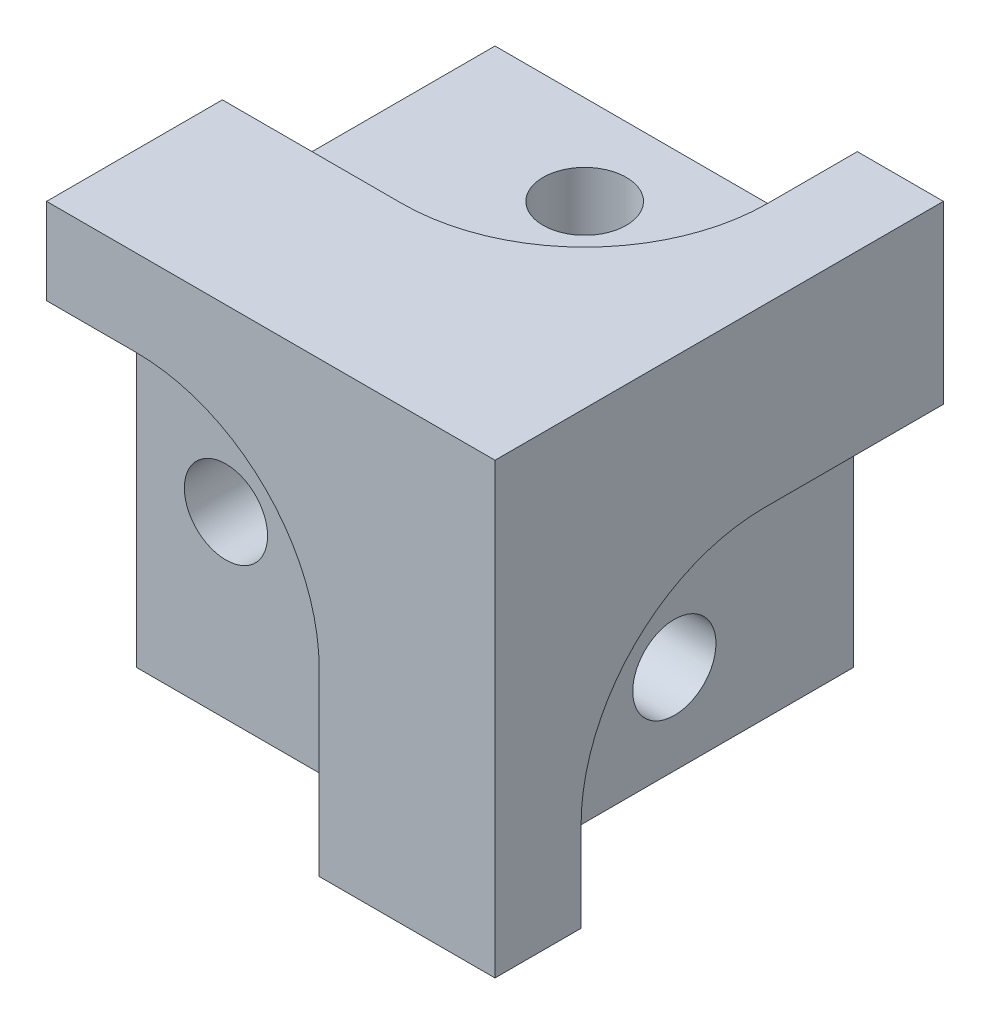
ISO-10303-21;
HEADER;
FILE_DESCRIPTION(('STEP AP214'),'2;1');
FILE_NAME('part.step','',(''),(''),'','','');
FILE_SCHEMA(('AUTOMOTIVE_DESIGN { 1 0 10303 214 1 1 1 1 }'));
ENDSEC;
DATA;
#1=APPLICATION_CONTEXT('core data for automotive mechanical design processes');
#2=APPLICATION_PROTOCOL_DEFINITION('international standard','automotive_design',2000,#1);
#3=PRODUCT_CONTEXT('',#1,'mechanical');
#4=PRODUCT('Part','Part','',(#3));
#5=PRODUCT_RELATED_PRODUCT_CATEGORY('part','',(#4));
#6=PRODUCT_DEFINITION_FORMATION('','',#4);
#7=PRODUCT_DEFINITION_CONTEXT('part definition',#1,'design');
#8=PRODUCT_DEFINITION('design','',#6,#7);
#9=PRODUCT_DEFINITION_SHAPE('','',#8);
#10=(LENGTH_UNIT() NAMED_UNIT(*) SI_UNIT(.MILLI.,.METRE.));
#11=(NAMED_UNIT(*) PLANE_ANGLE_UNIT() SI_UNIT($,.RADIAN.));
#12=(NAMED_UNIT(*) SI_UNIT($,.STERADIAN.) SOLID_ANGLE_UNIT());
#13=UNCERTAINTY_MEASURE_WITH_UNIT(LENGTH_MEASURE(1.E-05),#10,'distance_accuracy_value','');
#14=(GEOMETRIC_REPRESENTATION_CONTEXT(3) GLOBAL_UNCERTAINTY_ASSIGNED_CONTEXT((#13)) GLOBAL_UNIT_ASSIGNED_CONTEXT((#10,
#11,#12)) REPRESENTATION_CONTEXT('',''));
#15=CARTESIAN_POINT('',(0.,0.,0.));
#16=DIRECTION('',(0.,0.,1.));
#17=DIRECTION('',(1.,0.,0.));
#18=AXIS2_PLACEMENT_3D('',#15,#16,#17);
#19=CARTESIAN_POINT('',(7.9375,-7.9375,-7.9375));
#20=DIRECTION('',(1.,0.,0.));
#21=DIRECTION('',(0.,0.,-1.));
#22=AXIS2_PLACEMENT_3D('',#19,#20,#21);
#23=PLANE('',#22);
#24=DIRECTION('',(0.,0.,1.));
#25=VECTOR('',#24,1.);
#26=CARTESIAN_POINT('',(7.93750000000002,1.71449999999995,-1.58749999999997));
#27=LINE('',#26,#25);
#28=CARTESIAN_POINT('',(7.93750000000005,1.71449999999992,-7.93749999999997));
#29=VERTEX_POINT('',#28);
#30=CARTESIAN_POINT('',(7.93750000000002,1.71449999999995,-1.58749999999997));
#31=VERTEX_POINT('',#30);
#32=EDGE_CURVE('E172',#29,#31,#27,.T.);
#33=ORIENTED_EDGE('',*,*,#32,.F.);
#34=DIRECTION('',(0.,1.,0.));
#35=VECTOR('',#34,1.);
#36=CARTESIAN_POINT('',(7.9375,-7.9375,-7.9375));
#37=LINE('',#36,#35);
#38=CARTESIAN_POINT('',(7.9375,7.9375,-7.9375));
#39=VERTEX_POINT('',#38);
#40=EDGE_CURVE('E269',#29,#39,#37,.T.);
#41=ORIENTED_EDGE('',*,*,#40,.T.);
#42=DIRECTION('',(0.,0.,1.));
#43=VECTOR('',#42,1.);
#44=CARTESIAN_POINT('',(7.9375,7.9375,-7.9375));
#45=LINE('',#44,#43);
#46=CARTESIAN_POINT('',(7.9375,7.9375,7.9375));
#47=VERTEX_POINT('',#46);
#48=EDGE_CURVE('E278',#39,#47,#45,.T.);
#49=ORIENTED_EDGE('',*,*,#48,.T.);
#50=DIRECTION('',(0.,1.,0.));
#51=VECTOR('',#50,1.);
#52=CARTESIAN_POINT('',(7.9375,-7.9375,7.9375));
#53=LINE('',#52,#51);
#54=CARTESIAN_POINT('',(7.9375,-7.9375,7.9375));
#55=VERTEX_POINT('',#54);
#56=EDGE_CURVE('E257',#55,#47,#53,.T.);
#57=ORIENTED_EDGE('',*,*,#56,.F.);
#58=DIRECTION('',(0.,0.,1.));
#59=VECTOR('',#58,1.);
#60=CARTESIAN_POINT('',(7.9375,-7.9375,-7.9375));
#61=LINE('',#60,#59);
#62=CARTESIAN_POINT('',(7.93749999999993,-7.93750000000002,4.88950000000008));
#63=VERTEX_POINT('',#62);
#64=EDGE_CURVE('E11',#63,#55,#61,.T.);
#65=ORIENTED_EDGE('',*,*,#64,.F.);
#66=DIRECTION('',(0.,-1.,0.));
#67=VECTOR('',#66,1.);
#68=CARTESIAN_POINT('',(7.93749999999995,-4.76250000000002,4.88950000000007));
#69=LINE('',#68,#67);
#70=CARTESIAN_POINT('',(7.93749999999995,-4.76250000000002,4.88950000000007));
#71=VERTEX_POINT('',#70);
#72=EDGE_CURVE('E175',#71,#63,#69,.T.);
#73=ORIENTED_EDGE('',*,*,#72,.F.);
#74=CARTESIAN_POINT('',(7.93749999999998,-4.76250000000005,-1.58749999999993));
#75=DIRECTION('',(1.,0.,0.));
#76=DIRECTION('',(0.,-1.,0.));
#77=AXIS2_PLACEMENT_3D('',#74,#75,#76);
#78=CIRCLE('',#77,6.477);
#79=EDGE_CURVE('E159',#31,#71,#78,.T.);
#80=ORIENTED_EDGE('',*,*,#79,.F.);
#81=EDGE_LOOP('',(#33,#41,#49,#57,#65,#73,#80));
#82=FACE_BOUND('',#81,.T.);
#83=ADVANCED_FACE('F37',(#82),#23,.T.);
#84=CARTESIAN_POINT('',(-7.9375,-7.9375,-7.9375));
#85=DIRECTION('',(0.,-1.,0.));
#86=DIRECTION('',(0.,0.,-1.));
#87=AXIS2_PLACEMENT_3D('',#84,#85,#86);
#88=PLANE('',#87);
#89=DIRECTION('',(1.,0.,0.));
#90=VECTOR('',#89,1.);
#91=CARTESIAN_POINT('',(4.76249999999993,-7.9375,4.88950000000007));
#92=LINE('',#91,#90);
#93=CARTESIAN_POINT('',(4.76249999999993,-7.9375,4.88950000000007));
#94=VERTEX_POINT('',#93);
#95=EDGE_CURVE('E162',#94,#63,#92,.T.);
#96=ORIENTED_EDGE('',*,*,#95,.T.);
#97=ORIENTED_EDGE('',*,*,#64,.T.);
#98=DIRECTION('',(1.,0.,0.));
#99=VECTOR('',#98,1.);
#100=CARTESIAN_POINT('',(-7.9375,-7.9375,7.9375));
#101=LINE('',#100,#99);
#102=CARTESIAN_POINT('',(1.7145,-7.9375,7.9375));
#103=VERTEX_POINT('',#102);
#104=EDGE_CURVE('E266',#103,#55,#101,.T.);
#105=ORIENTED_EDGE('',*,*,#104,.F.);
#106=DIRECTION('',(0.,0.,1.));
#107=VECTOR('',#106,1.);
#108=CARTESIAN_POINT('',(1.7145,-7.9375,4.7625));
#109=LINE('',#108,#107);
#110=CARTESIAN_POINT('',(1.7145,-7.9375,4.7625));
#111=VERTEX_POINT('',#110);
#112=EDGE_CURVE('E247',#111,#103,#109,.T.);
#113=ORIENTED_EDGE('',*,*,#112,.F.);
#114=DIRECTION('',(1.,0.,0.));
#115=VECTOR('',#114,1.);
#116=CARTESIAN_POINT('',(-7.9375,-7.9375,4.7625));
#117=LINE('',#116,#115);
#118=CARTESIAN_POINT('',(-7.9375,-7.9375,4.7625));
#119=VERTEX_POINT('',#118);
#120=EDGE_CURVE('E233',#119,#111,#117,.T.);
#121=ORIENTED_EDGE('',*,*,#120,.F.);
#122=DIRECTION('',(0.,0.,1.));
#123=VECTOR('',#122,1.);
#124=CARTESIAN_POINT('',(-7.9375,-7.9375,-7.9375));
#125=LINE('',#124,#123);
#126=CARTESIAN_POINT('',(-7.9375,-7.9375,-7.9375));
#127=VERTEX_POINT('',#126);
#128=EDGE_CURVE('E45',#127,#119,#125,.T.);
#129=ORIENTED_EDGE('',*,*,#128,.F.);
#130=DIRECTION('',(1.,0.,0.));
#131=VECTOR('',#130,1.);
#132=CARTESIAN_POINT('',(-7.9375,-7.9375,-7.9375));
#133=LINE('',#132,#131);
#134=CARTESIAN_POINT('',(4.76250000000003,-7.9375,-7.9375));
#135=VERTEX_POINT('',#134);
#136=EDGE_CURVE('E276',#127,#135,#133,.T.);
#137=ORIENTED_EDGE('',*,*,#136,.T.);
#138=DIRECTION('',(0.,0.,-1.));
#139=VECTOR('',#138,1.);
#140=CARTESIAN_POINT('',(4.76249999999993,-7.9375,4.88950000000007));
#141=LINE('',#140,#139);
#142=EDGE_CURVE('E53',#94,#135,#141,.T.);
#143=ORIENTED_EDGE('',*,*,#142,.F.);
#144=EDGE_LOOP('',(#96,#97,#105,#113,#121,#129,#137,#143));
#145=FACE_BOUND('',#144,.T.);
#146=CARTESIAN_POINT('',(-1.58749999999997,-7.93750000000001,-4.76249999999998));
#147=DIRECTION('',(0.,1.,0.));
#148=DIRECTION('',(0.,0.,1.));
#149=AXIS2_PLACEMENT_3D('',#146,#147,#148);
#150=CIRCLE('',#149,1.4732);
#151=CARTESIAN_POINT('',(-1.58749999999997,-7.93750000000001,-3.28929999999999));
#152=VERTEX_POINT('',#151);
#153=EDGE_CURVE('E220',#152,#152,#150,.T.);
#154=ORIENTED_EDGE('',*,*,#153,.T.);
#155=EDGE_LOOP('',(#154));
#156=FACE_BOUND('',#155,.T.);
#157=ADVANCED_FACE('F309',(#145,#156),#88,.T.);
#158=CARTESIAN_POINT('',(-7.9375,-7.9375,-7.9375));
#159=DIRECTION('',(-1.,0.,0.));
#160=DIRECTION('',(0.,0.,1.));
#161=AXIS2_PLACEMENT_3D('',#158,#159,#160);
#162=PLANE('',#161);
#163=DIRECTION('',(0.,1.,0.));
#164=VECTOR('',#163,1.);
#165=CARTESIAN_POINT('',(-7.93749999999999,4.76250000000003,1.71449999999997));
#166=LINE('',#165,#164);
#167=CARTESIAN_POINT('',(-7.93749999999999,4.76250000000003,1.71449999999997));
#168=VERTEX_POINT('',#167);
#169=CARTESIAN_POINT('',(-7.93749999999998,7.93750000000003,1.71449999999996));
#170=VERTEX_POINT('',#169);
#171=EDGE_CURVE('E211',#168,#170,#166,.T.);
#172=ORIENTED_EDGE('',*,*,#171,.F.);
#173=DIRECTION('',(0.,0.,1.));
#174=VECTOR('',#173,1.);
#175=CARTESIAN_POINT('',(-7.93749999999997,4.7625,-7.93750000000003));
#176=LINE('',#175,#174);
#177=CARTESIAN_POINT('',(-7.93749999999997,4.7625,-7.93750000000003));
#178=VERTEX_POINT('',#177);
#179=EDGE_CURVE('E195',#178,#168,#176,.T.);
#180=ORIENTED_EDGE('',*,*,#179,.F.);
#181=DIRECTION('',(0.,-1.,0.));
#182=VECTOR('',#181,1.);
#183=CARTESIAN_POINT('',(-7.9375,-7.9375,-7.9375));
#184=LINE('',#183,#182);
#185=EDGE_CURVE('E274',#178,#127,#184,.T.);
#186=ORIENTED_EDGE('',*,*,#185,.T.);
#187=ORIENTED_EDGE('',*,*,#128,.T.);
#188=DIRECTION('',(0.,-1.,0.));
#189=VECTOR('',#188,1.);
#190=CARTESIAN_POINT('',(-7.9375,4.8895,4.7625));
#191=LINE('',#190,#189);
#192=CARTESIAN_POINT('',(-7.9375,4.8895,4.7625));
#193=VERTEX_POINT('',#192);
#194=EDGE_CURVE('E231',#193,#119,#191,.T.);
#195=ORIENTED_EDGE('',*,*,#194,.F.);
#196=DIRECTION('',(0.,0.,1.));
#197=VECTOR('',#196,1.);
#198=CARTESIAN_POINT('',(-7.9375,4.8895,4.7625));
#199=LINE('',#198,#197);
#200=CARTESIAN_POINT('',(-7.9375,4.8895,7.9375));
#201=VERTEX_POINT('',#200);
#202=EDGE_CURVE('E249',#193,#201,#199,.T.);
#203=ORIENTED_EDGE('',*,*,#202,.T.);
#204=DIRECTION('',(0.,-1.,0.));
#205=VECTOR('',#204,1.);
#206=CARTESIAN_POINT('',(-7.9375,-7.9375,7.9375));
#207=LINE('',#206,#205);
#208=CARTESIAN_POINT('',(-7.9375,7.9375,7.9375));
#209=VERTEX_POINT('',#208);
#210=EDGE_CURVE('E263',#209,#201,#207,.T.);
#211=ORIENTED_EDGE('',*,*,#210,.F.);
#212=DIRECTION('',(0.,0.,1.));
#213=VECTOR('',#212,1.);
#214=CARTESIAN_POINT('',(-7.9375,7.9375,-7.9375));
#215=LINE('',#214,#213);
#216=EDGE_CURVE('E282',#170,#209,#215,.T.);
#217=ORIENTED_EDGE('',*,*,#216,.F.);
#218=EDGE_LOOP('',(#172,#180,#186,#187,#195,#203,#211,#217));
#219=FACE_BOUND('',#218,.T.);
#220=CARTESIAN_POINT('',(-7.93750000000002,-4.76250000000005,-1.58750000000002));
#221=DIRECTION('',(1.,0.,0.));
#222=DIRECTION('',(0.,0.,-1.));
#223=AXIS2_PLACEMENT_3D('',#220,#221,#222);
#224=CIRCLE('',#223,1.4732);
#225=CARTESIAN_POINT('',(-7.93750000000001,-4.76250000000005,-3.06070000000001));
#226=VERTEX_POINT('',#225);
#227=EDGE_CURVE('E217',#226,#226,#224,.T.);
#228=ORIENTED_EDGE('',*,*,#227,.T.);
#229=EDGE_LOOP('',(#228));
#230=FACE_BOUND('',#229,.T.);
#231=ADVANCED_FACE('F314',(#219,#230),#162,.T.);
#232=CARTESIAN_POINT('',(-7.9375,7.9375,-7.9375));
#233=DIRECTION('',(0.,1.,0.));
#234=DIRECTION('',(0.,0.,1.));
#235=AXIS2_PLACEMENT_3D('',#232,#233,#234);
#236=PLANE('',#235);
#237=DIRECTION('',(1.,0.,0.));
#238=VECTOR('',#237,1.);
#239=CARTESIAN_POINT('',(-1.58749999999998,7.93750000000001,1.71449999999998));
#240=LINE('',#239,#238);
#241=CARTESIAN_POINT('',(-1.58749999999998,7.93750000000001,1.71449999999998));
#242=VERTEX_POINT('',#241);
#243=EDGE_CURVE('E191',#170,#242,#240,.T.);
#244=ORIENTED_EDGE('',*,*,#243,.F.);
#245=ORIENTED_EDGE('',*,*,#216,.T.);
#246=DIRECTION('',(-1.,0.,0.));
#247=VECTOR('',#246,1.);
#248=CARTESIAN_POINT('',(-7.9375,7.9375,7.9375));
#249=LINE('',#248,#247);
#250=EDGE_CURVE('E260',#47,#209,#249,.T.);
#251=ORIENTED_EDGE('',*,*,#250,.F.);
#252=ORIENTED_EDGE('',*,*,#48,.F.);
#253=DIRECTION('',(-1.,0.,0.));
#254=VECTOR('',#253,1.);
#255=CARTESIAN_POINT('',(-7.9375,7.9375,-7.9375));
#256=LINE('',#255,#254);
#257=CARTESIAN_POINT('',(4.88950000000004,7.93749999999997,-7.93750000000001));
#258=VERTEX_POINT('',#257);
#259=EDGE_CURVE('E271',#39,#258,#256,.T.);
#260=ORIENTED_EDGE('',*,*,#259,.T.);
#261=DIRECTION('',(0.,0.,-1.));
#262=VECTOR('',#261,1.);
#263=CARTESIAN_POINT('',(4.88950000000003,7.93749999999997,-4.76250000000001));
#264=LINE('',#263,#262);
#265=CARTESIAN_POINT('',(4.88950000000003,7.93749999999997,-4.76250000000001));
#266=VERTEX_POINT('',#265);
#267=EDGE_CURVE('E204',#266,#258,#264,.T.);
#268=ORIENTED_EDGE('',*,*,#267,.F.);
#269=CARTESIAN_POINT('',(-1.58749999999997,7.93749999999999,-4.76250000000002));
#270=DIRECTION('',(0.,1.,0.));
#271=DIRECTION('',(0.,0.,-1.));
#272=AXIS2_PLACEMENT_3D('',#269,#270,#271);
#273=CIRCLE('',#272,6.477);
#274=EDGE_CURVE('E201',#242,#266,#273,.T.);
#275=ORIENTED_EDGE('',*,*,#274,.F.);
#276=EDGE_LOOP('',(#244,#245,#251,#252,#260,#268,#275));
#277=FACE_BOUND('',#276,.T.);
#278=ADVANCED_FACE('F330',(#277),#236,.T.);
#279=CARTESIAN_POINT('',(0.,0.,-7.9375));
#280=DIRECTION('',(0.,0.,-1.));
#281=DIRECTION('',(-1.,0.,0.));
#282=AXIS2_PLACEMENT_3D('',#279,#280,#281);
#283=PLANE('',#282);
#284=DIRECTION('',(1.,0.,0.));
#285=VECTOR('',#284,1.);
#286=CARTESIAN_POINT('',(4.76250000000005,1.71449999999993,-7.93749999999998));
#287=LINE('',#286,#285);
#288=CARTESIAN_POINT('',(4.76250000000005,1.71449999999993,-7.93749999999998));
#289=VERTEX_POINT('',#288);
#290=EDGE_CURVE('E186',#289,#29,#287,.T.);
#291=ORIENTED_EDGE('',*,*,#290,.F.);
#292=DIRECTION('',(0.,1.,0.));
#293=VECTOR('',#292,1.);
#294=CARTESIAN_POINT('',(4.7625,-7.93750000000007,-7.93749999999993));
#295=LINE('',#294,#293);
#296=EDGE_CURVE('E179',#135,#289,#295,.T.);
#297=ORIENTED_EDGE('',*,*,#296,.F.);
#298=ORIENTED_EDGE('',*,*,#136,.F.);
#299=ORIENTED_EDGE('',*,*,#185,.F.);
#300=DIRECTION('',(-1.,0.,0.));
#301=VECTOR('',#300,1.);
#302=CARTESIAN_POINT('',(4.88950000000003,4.76249999999997,-7.9375));
#303=LINE('',#302,#301);
#304=CARTESIAN_POINT('',(4.88950000000003,4.76249999999997,-7.9375));
#305=VERTEX_POINT('',#304);
#306=EDGE_CURVE('E193',#305,#178,#303,.T.);
#307=ORIENTED_EDGE('',*,*,#306,.F.);
#308=DIRECTION('',(0.,1.,0.));
#309=VECTOR('',#308,1.);
#310=CARTESIAN_POINT('',(4.88950000000003,4.76249999999997,-7.9375));
#311=LINE('',#310,#309);
#312=EDGE_CURVE('E213',#305,#258,#311,.T.);
#313=ORIENTED_EDGE('',*,*,#312,.T.);
#314=ORIENTED_EDGE('',*,*,#259,.F.);
#315=ORIENTED_EDGE('',*,*,#40,.F.);
#316=EDGE_LOOP('',(#291,#297,#298,#299,#307,#313,#314,#315));
#317=FACE_BOUND('',#316,.T.);
#318=CARTESIAN_POINT('',(-4.7625,-1.5875,-7.9375));
#319=DIRECTION('',(0.,0.,1.));
#320=DIRECTION('',(1.,0.,0.));
#321=AXIS2_PLACEMENT_3D('',#318,#319,#320);
#322=CIRCLE('',#321,1.4732);
#323=CARTESIAN_POINT('',(-3.2893,-1.5875,-7.9375));
#324=VERTEX_POINT('',#323);
#325=EDGE_CURVE('E254',#324,#324,#322,.T.);
#326=ORIENTED_EDGE('',*,*,#325,.T.);
#327=EDGE_LOOP('',(#326));
#328=FACE_BOUND('',#327,.T.);
#329=ADVANCED_FACE('F324',(#317,#328),#283,.T.);
#330=CARTESIAN_POINT('',(0.,0.,7.9375));
#331=DIRECTION('',(0.,0.,-1.));
#332=DIRECTION('',(-1.,0.,0.));
#333=AXIS2_PLACEMENT_3D('',#330,#331,#332);
#334=PLANE('',#333);
#335=CARTESIAN_POINT('',(-4.7625,-1.5875,7.9375));
#336=DIRECTION('',(0.,0.,1.));
#337=DIRECTION('',(-1.,0.,0.));
#338=AXIS2_PLACEMENT_3D('',#335,#336,#337);
#339=CIRCLE('',#338,6.477);
#340=CARTESIAN_POINT('',(1.7145,-1.5875,7.9375));
#341=VERTEX_POINT('',#340);
#342=CARTESIAN_POINT('',(-4.7625,4.8895,7.9375));
#343=VERTEX_POINT('',#342);
#344=EDGE_CURVE('E223',#341,#343,#339,.T.);
#345=ORIENTED_EDGE('',*,*,#344,.F.);
#346=DIRECTION('',(0.,1.,0.));
#347=VECTOR('',#346,1.);
#348=CARTESIAN_POINT('',(1.7145,-1.5875,7.9375));
#349=LINE('',#348,#347);
#350=EDGE_CURVE('E228',#103,#341,#349,.T.);
#351=ORIENTED_EDGE('',*,*,#350,.F.);
#352=ORIENTED_EDGE('',*,*,#104,.T.);
#353=ORIENTED_EDGE('',*,*,#56,.T.);
#354=ORIENTED_EDGE('',*,*,#250,.T.);
#355=ORIENTED_EDGE('',*,*,#210,.T.);
#356=DIRECTION('',(-1.,0.,0.));
#357=VECTOR('',#356,1.);
#358=CARTESIAN_POINT('',(-4.7625,4.8895,7.9375));
#359=LINE('',#358,#357);
#360=EDGE_CURVE('E240',#343,#201,#359,.T.);
#361=ORIENTED_EDGE('',*,*,#360,.F.);
#362=EDGE_LOOP('',(#345,#351,#352,#353,#354,#355,#361));
#363=FACE_BOUND('',#362,.T.);
#364=ADVANCED_FACE('F337',(#363),#334,.F.);
#365=CARTESIAN_POINT('',(-4.7625,-1.5875,7.9375));
#366=DIRECTION('',(0.,0.,1.));
#367=DIRECTION('',(1.,0.,0.));
#368=AXIS2_PLACEMENT_3D('',#365,#366,#367);
#369=CYLINDRICAL_SURFACE('',#368,1.4732);
#370=CARTESIAN_POINT('',(-4.7625,-1.5875,4.7625));
#371=DIRECTION('',(0.,0.,-1.));
#372=DIRECTION('',(-1.,0.,0.));
#373=AXIS2_PLACEMENT_3D('',#370,#371,#372);
#374=CIRCLE('',#373,1.4732);
#375=CARTESIAN_POINT('',(-6.2357,-1.5875,4.7625));
#376=VERTEX_POINT('',#375);
#377=EDGE_CURVE('E246',#376,#376,#374,.F.);
#378=ORIENTED_EDGE('',*,*,#377,.T.);
#379=EDGE_LOOP('',(#378));
#380=FACE_BOUND('',#379,.T.);
#381=ORIENTED_EDGE('',*,*,#325,.F.);
#382=EDGE_LOOP('',(#381));
#383=FACE_BOUND('',#382,.T.);
#384=ADVANCED_FACE('F375',(#380,#383),#369,.F.);
#385=CARTESIAN_POINT('',(-4.7625,-1.5875,4.7625));
#386=DIRECTION('',(0.,0.,-1.));
#387=DIRECTION('',(-1.,0.,0.));
#388=AXIS2_PLACEMENT_3D('',#385,#386,#387);
#389=PLANE('',#388);
#390=CARTESIAN_POINT('',(-4.7625,-1.5875,4.7625));
#391=DIRECTION('',(0.,0.,1.));
#392=DIRECTION('',(-1.,0.,0.));
#393=AXIS2_PLACEMENT_3D('',#390,#391,#392);
#394=CIRCLE('',#393,6.477);
#395=CARTESIAN_POINT('',(1.7145,-1.5875,4.7625));
#396=VERTEX_POINT('',#395);
#397=CARTESIAN_POINT('',(-4.7625,4.8895,4.7625));
#398=VERTEX_POINT('',#397);
#399=EDGE_CURVE('E224',#396,#398,#394,.T.);
#400=ORIENTED_EDGE('',*,*,#399,.T.);
#401=DIRECTION('',(-1.,0.,0.));
#402=VECTOR('',#401,1.);
#403=CARTESIAN_POINT('',(-4.7625,4.8895,4.7625));
#404=LINE('',#403,#402);
#405=EDGE_CURVE('E227',#398,#193,#404,.T.);
#406=ORIENTED_EDGE('',*,*,#405,.T.);
#407=ORIENTED_EDGE('',*,*,#194,.T.);
#408=ORIENTED_EDGE('',*,*,#120,.T.);
#409=DIRECTION('',(0.,1.,0.));
#410=VECTOR('',#409,1.);
#411=CARTESIAN_POINT('',(1.7145,-1.5875,4.7625));
#412=LINE('',#411,#410);
#413=EDGE_CURVE('E235',#111,#396,#412,.T.);
#414=ORIENTED_EDGE('',*,*,#413,.T.);
#415=EDGE_LOOP('',(#400,#406,#407,#408,#414));
#416=FACE_BOUND('',#415,.T.);
#417=ORIENTED_EDGE('',*,*,#377,.F.);
#418=EDGE_LOOP('',(#417));
#419=FACE_BOUND('',#418,.T.);
#420=ADVANCED_FACE('F371',(#416,#419),#389,.F.);
#421=CARTESIAN_POINT('',(-4.7625,-1.5875,4.7625));
#422=DIRECTION('',(0.,0.,1.));
#423=DIRECTION('',(1.,0.,0.));
#424=AXIS2_PLACEMENT_3D('',#421,#422,#423);
#425=CYLINDRICAL_SURFACE('',#424,6.477);
#426=ORIENTED_EDGE('',*,*,#344,.T.);
#427=DIRECTION('',(0.,0.,1.));
#428=VECTOR('',#427,1.);
#429=CARTESIAN_POINT('',(-4.7625,4.8895,4.7625));
#430=LINE('',#429,#428);
#431=EDGE_CURVE('E238',#398,#343,#430,.T.);
#432=ORIENTED_EDGE('',*,*,#431,.F.);
#433=ORIENTED_EDGE('',*,*,#399,.F.);
#434=DIRECTION('',(0.,0.,1.));
#435=VECTOR('',#434,1.);
#436=CARTESIAN_POINT('',(1.7145,-1.5875,4.7625));
#437=LINE('',#436,#435);
#438=EDGE_CURVE('E244',#396,#341,#437,.T.);
#439=ORIENTED_EDGE('',*,*,#438,.T.);
#440=EDGE_LOOP('',(#426,#432,#433,#439));
#441=FACE_BOUND('',#440,.T.);
#442=ADVANCED_FACE('F374',(#441),#425,.F.);
#443=CARTESIAN_POINT('',(1.7145,-1.5875,4.7625));
#444=DIRECTION('',(1.,0.,0.));
#445=DIRECTION('',(0.,0.,-1.));
#446=AXIS2_PLACEMENT_3D('',#443,#444,#445);
#447=PLANE('',#446);
#448=ORIENTED_EDGE('',*,*,#350,.T.);
#449=ORIENTED_EDGE('',*,*,#438,.F.);
#450=ORIENTED_EDGE('',*,*,#413,.F.);
#451=ORIENTED_EDGE('',*,*,#112,.T.);
#452=EDGE_LOOP('',(#448,#449,#450,#451));
#453=FACE_BOUND('',#452,.T.);
#454=ADVANCED_FACE('F377',(#453),#447,.F.);
#455=CARTESIAN_POINT('',(-4.7625,4.8895,4.7625));
#456=DIRECTION('',(0.,1.,0.));
#457=DIRECTION('',(0.,0.,1.));
#458=AXIS2_PLACEMENT_3D('',#455,#456,#457);
#459=PLANE('',#458);
#460=ORIENTED_EDGE('',*,*,#360,.T.);
#461=ORIENTED_EDGE('',*,*,#202,.F.);
#462=ORIENTED_EDGE('',*,*,#405,.F.);
#463=ORIENTED_EDGE('',*,*,#431,.T.);
#464=EDGE_LOOP('',(#460,#461,#462,#463));
#465=FACE_BOUND('',#464,.T.);
#466=ADVANCED_FACE('F370',(#465),#459,.F.);
#467=CARTESIAN_POINT('',(-1.58749999999997,7.93749999999999,-4.76250000000002));
#468=DIRECTION('',(0.,1.,0.));
#469=DIRECTION('',(0.,0.,1.));
#470=AXIS2_PLACEMENT_3D('',#467,#468,#469);
#471=CYLINDRICAL_SURFACE('',#470,1.4732);
#472=CARTESIAN_POINT('',(-1.58749999999997,4.76249999999999,-4.76250000000002));
#473=DIRECTION('',(0.,-1.,0.));
#474=DIRECTION('',(1.,0.,0.));
#475=AXIS2_PLACEMENT_3D('',#472,#473,#474);
#476=CIRCLE('',#475,1.4732);
#477=CARTESIAN_POINT('',(-0.114299999999969,4.76249999999999,-4.76250000000002));
#478=VERTEX_POINT('',#477);
#479=EDGE_CURVE('E210',#478,#478,#476,.F.);
#480=ORIENTED_EDGE('',*,*,#479,.T.);
#481=EDGE_LOOP('',(#480));
#482=FACE_BOUND('',#481,.T.);
#483=ORIENTED_EDGE('',*,*,#153,.F.);
#484=EDGE_LOOP('',(#483));
#485=FACE_BOUND('',#484,.T.);
#486=ADVANCED_FACE('F289',(#482,#485),#471,.F.);
#487=CARTESIAN_POINT('',(7.93749999999998,-4.76250000000005,-1.58749999999993));
#488=DIRECTION('',(1.,0.,0.));
#489=DIRECTION('',(0.,0.,-1.));
#490=AXIS2_PLACEMENT_3D('',#487,#488,#489);
#491=CYLINDRICAL_SURFACE('',#490,1.4732);
#492=CARTESIAN_POINT('',(4.76249999999998,-4.76250000000005,-1.58749999999995));
#493=DIRECTION('',(-1.,0.,0.));
#494=DIRECTION('',(0.,-1.,0.));
#495=AXIS2_PLACEMENT_3D('',#492,#493,#494);
#496=CIRCLE('',#495,1.4732);
#497=CARTESIAN_POINT('',(4.76249999999998,-6.23570000000005,-1.58749999999995));
#498=VERTEX_POINT('',#497);
#499=EDGE_CURVE('E40',#498,#498,#496,.F.);
#500=ORIENTED_EDGE('',*,*,#499,.T.);
#501=EDGE_LOOP('',(#500));
#502=FACE_BOUND('',#501,.T.);
#503=ORIENTED_EDGE('',*,*,#227,.F.);
#504=EDGE_LOOP('',(#503));
#505=FACE_BOUND('',#504,.T.);
#506=ADVANCED_FACE('F295',(#502,#505),#491,.F.);
#507=CARTESIAN_POINT('',(-1.58749999999997,4.76249999999999,-4.76250000000002));
#508=DIRECTION('',(0.,-1.,0.));
#509=DIRECTION('',(0.,0.,-1.));
#510=AXIS2_PLACEMENT_3D('',#507,#508,#509);
#511=PLANE('',#510);
#512=CARTESIAN_POINT('',(-1.58749999999997,4.76249999999999,-4.76250000000002));
#513=DIRECTION('',(0.,1.,0.));
#514=DIRECTION('',(0.,0.,-1.));
#515=AXIS2_PLACEMENT_3D('',#512,#513,#514);
#516=CIRCLE('',#515,6.477);
#517=CARTESIAN_POINT('',(-1.58749999999999,4.76250000000001,1.71449999999998));
#518=VERTEX_POINT('',#517);
#519=CARTESIAN_POINT('',(4.88950000000003,4.76249999999997,-4.7625));
#520=VERTEX_POINT('',#519);
#521=EDGE_CURVE('E189',#518,#520,#516,.T.);
#522=ORIENTED_EDGE('',*,*,#521,.T.);
#523=DIRECTION('',(0.,0.,-1.));
#524=VECTOR('',#523,1.);
#525=CARTESIAN_POINT('',(4.88950000000003,4.76249999999997,-4.7625));
#526=LINE('',#525,#524);
#527=EDGE_CURVE('E61',#520,#305,#526,.T.);
#528=ORIENTED_EDGE('',*,*,#527,.T.);
#529=ORIENTED_EDGE('',*,*,#306,.T.);
#530=ORIENTED_EDGE('',*,*,#179,.T.);
#531=DIRECTION('',(1.,0.,0.));
#532=VECTOR('',#531,1.);
#533=CARTESIAN_POINT('',(-1.58749999999999,4.76250000000001,1.71449999999998));
#534=LINE('',#533,#532);
#535=EDGE_CURVE('E197',#168,#518,#534,.T.);
#536=ORIENTED_EDGE('',*,*,#535,.T.);
#537=EDGE_LOOP('',(#522,#528,#529,#530,#536));
#538=FACE_BOUND('',#537,.T.);
#539=ORIENTED_EDGE('',*,*,#479,.F.);
#540=EDGE_LOOP('',(#539));
#541=FACE_BOUND('',#540,.T.);
#542=ADVANCED_FACE('F292',(#538,#541),#511,.F.);
#543=CARTESIAN_POINT('',(-1.58749999999997,4.76249999999999,-4.76250000000002));
#544=DIRECTION('',(0.,1.,0.));
#545=DIRECTION('',(-1.,0.,0.));
#546=AXIS2_PLACEMENT_3D('',#543,#544,#545);
#547=CYLINDRICAL_SURFACE('',#546,6.477);
#548=ORIENTED_EDGE('',*,*,#274,.T.);
#549=DIRECTION('',(0.,1.,0.));
#550=VECTOR('',#549,1.);
#551=CARTESIAN_POINT('',(4.88950000000003,4.76249999999997,-4.7625));
#552=LINE('',#551,#550);
#553=EDGE_CURVE('E200',#520,#266,#552,.T.);
#554=ORIENTED_EDGE('',*,*,#553,.F.);
#555=ORIENTED_EDGE('',*,*,#521,.F.);
#556=DIRECTION('',(0.,1.,0.));
#557=VECTOR('',#556,1.);
#558=CARTESIAN_POINT('',(-1.58749999999999,4.76250000000001,1.71449999999998));
#559=LINE('',#558,#557);
#560=EDGE_CURVE('E208',#518,#242,#559,.T.);
#561=ORIENTED_EDGE('',*,*,#560,.T.);
#562=EDGE_LOOP('',(#548,#554,#555,#561));
#563=FACE_BOUND('',#562,.T.);
#564=ADVANCED_FACE('F294',(#563),#547,.F.);
#565=CARTESIAN_POINT('',(-1.58749999999999,4.76250000000001,1.71449999999998));
#566=DIRECTION('',(0.,0.,1.));
#567=DIRECTION('',(1.,0.,0.));
#568=AXIS2_PLACEMENT_3D('',#565,#566,#567);
#569=PLANE('',#568);
#570=ORIENTED_EDGE('',*,*,#243,.T.);
#571=ORIENTED_EDGE('',*,*,#560,.F.);
#572=ORIENTED_EDGE('',*,*,#535,.F.);
#573=ORIENTED_EDGE('',*,*,#171,.T.);
#574=EDGE_LOOP('',(#570,#571,#572,#573));
#575=FACE_BOUND('',#574,.T.);
#576=ADVANCED_FACE('F301',(#575),#569,.F.);
#577=CARTESIAN_POINT('',(4.88950000000003,4.76249999999997,-4.7625));
#578=DIRECTION('',(1.,0.,0.));
#579=DIRECTION('',(0.,1.,0.));
#580=AXIS2_PLACEMENT_3D('',#577,#578,#579);
#581=PLANE('',#580);
#582=ORIENTED_EDGE('',*,*,#267,.T.);
#583=ORIENTED_EDGE('',*,*,#312,.F.);
#584=ORIENTED_EDGE('',*,*,#527,.F.);
#585=ORIENTED_EDGE('',*,*,#553,.T.);
#586=EDGE_LOOP('',(#582,#583,#584,#585));
#587=FACE_BOUND('',#586,.T.);
#588=ADVANCED_FACE('F357',(#587),#581,.F.);
#589=CARTESIAN_POINT('',(4.76249999999998,-4.76250000000003,-1.58749999999995));
#590=DIRECTION('',(-1.,0.,0.));
#591=DIRECTION('',(0.,-1.,0.));
#592=AXIS2_PLACEMENT_3D('',#589,#590,#591);
#593=PLANE('',#592);
#594=CARTESIAN_POINT('',(4.76249999999998,-4.76250000000003,-1.58749999999995));
#595=DIRECTION('',(1.,0.,0.));
#596=DIRECTION('',(0.,-1.,0.));
#597=AXIS2_PLACEMENT_3D('',#594,#595,#596);
#598=CIRCLE('',#597,6.477);
#599=CARTESIAN_POINT('',(4.76250000000002,1.71449999999997,-1.58749999999998));
#600=VERTEX_POINT('',#599);
#601=CARTESIAN_POINT('',(4.76249999999995,-4.7625,4.88950000000005));
#602=VERTEX_POINT('',#601);
#603=EDGE_CURVE('E156',#600,#602,#598,.T.);
#604=ORIENTED_EDGE('',*,*,#603,.T.);
#605=DIRECTION('',(0.,-1.,0.));
#606=VECTOR('',#605,1.);
#607=CARTESIAN_POINT('',(4.76249999999995,-4.7625,4.88950000000005));
#608=LINE('',#607,#606);
#609=EDGE_CURVE('E165',#602,#94,#608,.T.);
#610=ORIENTED_EDGE('',*,*,#609,.T.);
#611=ORIENTED_EDGE('',*,*,#142,.T.);
#612=ORIENTED_EDGE('',*,*,#296,.T.);
#613=DIRECTION('',(0.,0.,1.));
#614=VECTOR('',#613,1.);
#615=CARTESIAN_POINT('',(4.76250000000002,1.71449999999997,-1.58749999999998));
#616=LINE('',#615,#614);
#617=EDGE_CURVE('E163',#289,#600,#616,.T.);
#618=ORIENTED_EDGE('',*,*,#617,.T.);
#619=EDGE_LOOP('',(#604,#610,#611,#612,#618));
#620=FACE_BOUND('',#619,.T.);
#621=ORIENTED_EDGE('',*,*,#499,.F.);
#622=EDGE_LOOP('',(#621));
#623=FACE_BOUND('',#622,.T.);
#624=ADVANCED_FACE('F169',(#620,#623),#593,.F.);
#625=CARTESIAN_POINT('',(4.76249999999998,-4.76250000000003,-1.58749999999995));
#626=DIRECTION('',(1.,0.,0.));
#627=DIRECTION('',(0.,1.,0.));
#628=AXIS2_PLACEMENT_3D('',#625,#626,#627);
#629=CYLINDRICAL_SURFACE('',#628,6.477);
#630=ORIENTED_EDGE('',*,*,#79,.T.);
#631=DIRECTION('',(1.,0.,0.));
#632=VECTOR('',#631,1.);
#633=CARTESIAN_POINT('',(4.76249999999995,-4.7625,4.88950000000005));
#634=LINE('',#633,#632);
#635=EDGE_CURVE('E152',#602,#71,#634,.T.);
#636=ORIENTED_EDGE('',*,*,#635,.F.);
#637=ORIENTED_EDGE('',*,*,#603,.F.);
#638=DIRECTION('',(1.,0.,0.));
#639=VECTOR('',#638,1.);
#640=CARTESIAN_POINT('',(4.76250000000002,1.71449999999997,-1.58749999999998));
#641=LINE('',#640,#639);
#642=EDGE_CURVE('E184',#600,#31,#641,.T.);
#643=ORIENTED_EDGE('',*,*,#642,.T.);
#644=EDGE_LOOP('',(#630,#636,#637,#643));
#645=FACE_BOUND('',#644,.T.);
#646=ADVANCED_FACE('F154',(#645),#629,.F.);
#647=CARTESIAN_POINT('',(4.76250000000002,1.71449999999997,-1.58749999999998));
#648=DIRECTION('',(0.,1.,0.));
#649=DIRECTION('',(-1.,0.,0.));
#650=AXIS2_PLACEMENT_3D('',#647,#648,#649);
#651=PLANE('',#650);
#652=ORIENTED_EDGE('',*,*,#32,.T.);
#653=ORIENTED_EDGE('',*,*,#642,.F.);
#654=ORIENTED_EDGE('',*,*,#617,.F.);
#655=ORIENTED_EDGE('',*,*,#290,.T.);
#656=EDGE_LOOP('',(#652,#653,#654,#655));
#657=FACE_BOUND('',#656,.T.);
#658=ADVANCED_FACE('F347',(#657),#651,.F.);
#659=CARTESIAN_POINT('',(4.76249999999995,-4.7625,4.88950000000005));
#660=DIRECTION('',(0.,0.,1.));
#661=DIRECTION('',(0.,-1.,0.));
#662=AXIS2_PLACEMENT_3D('',#659,#660,#661);
#663=PLANE('',#662);
#664=ORIENTED_EDGE('',*,*,#72,.T.);
#665=ORIENTED_EDGE('',*,*,#95,.F.);
#666=ORIENTED_EDGE('',*,*,#609,.F.);
#667=ORIENTED_EDGE('',*,*,#635,.T.);
#668=EDGE_LOOP('',(#664,#665,#666,#667));
#669=FACE_BOUND('',#668,.T.);
#670=ADVANCED_FACE('F166',(#669),#663,.F.);
#671=CLOSED_SHELL('',(#83,#157,#231,#278,#329,#364,#384,#420,#442,#454,#466,#486,#506,#542,#564,
#576,#588,#624,#646,#658,#670));
#672=MANIFOLD_SOLID_BREP('B2',#671);
#673=ADVANCED_BREP_SHAPE_REPRESENTATION('',(#18,#672),#14);
#674=SHAPE_DEFINITION_REPRESENTATION(#9,#673);
ENDSEC;
END-ISO-10303-21;
